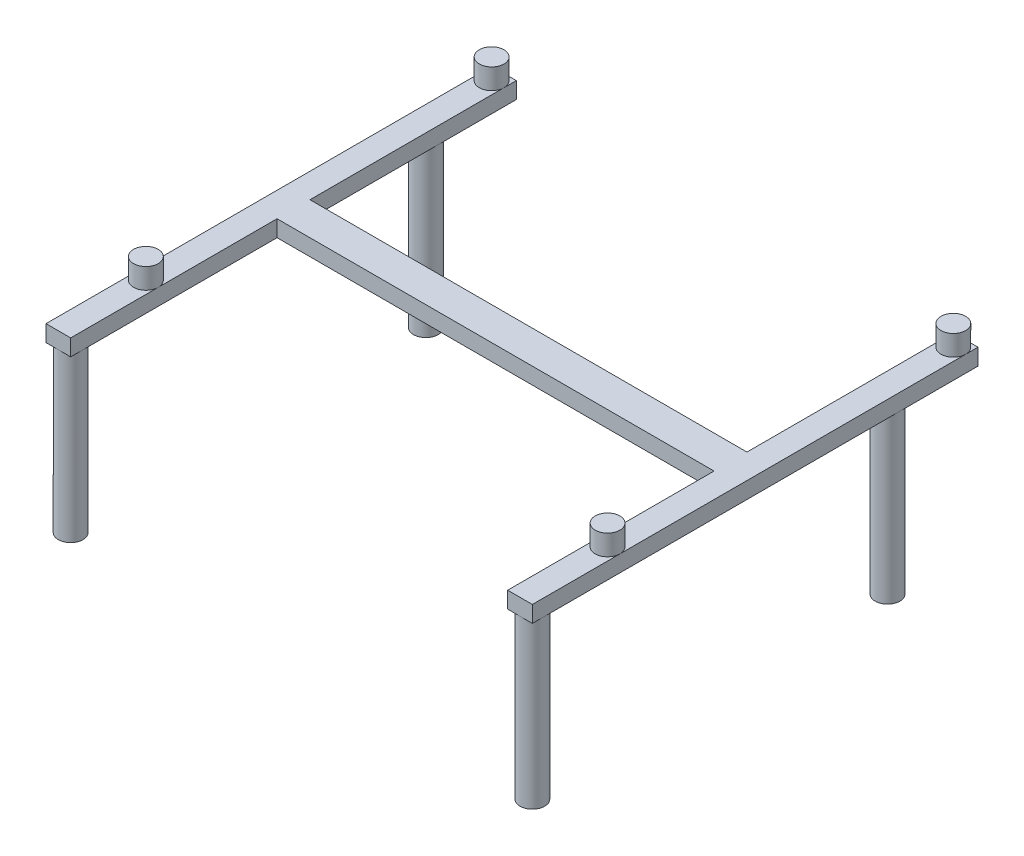
ISO-10303-21;
HEADER;
FILE_DESCRIPTION(('STEP AP214'),'2;1');
FILE_NAME('part.step','',(''),(''),'','','');
FILE_SCHEMA(('AUTOMOTIVE_DESIGN { 1 0 10303 214 1 1 1 1 }'));
ENDSEC;
DATA;
#1=APPLICATION_CONTEXT('core data for automotive mechanical design processes');
#2=APPLICATION_PROTOCOL_DEFINITION('international standard','automotive_design',2000,#1);
#3=PRODUCT_CONTEXT('',#1,'mechanical');
#4=PRODUCT('Part','Part','',(#3));
#5=PRODUCT_RELATED_PRODUCT_CATEGORY('part','',(#4));
#6=PRODUCT_DEFINITION_FORMATION('','',#4);
#7=PRODUCT_DEFINITION_CONTEXT('part definition',#1,'design');
#8=PRODUCT_DEFINITION('design','',#6,#7);
#9=PRODUCT_DEFINITION_SHAPE('','',#8);
#10=(LENGTH_UNIT() NAMED_UNIT(*) SI_UNIT(.MILLI.,.METRE.));
#11=(NAMED_UNIT(*) PLANE_ANGLE_UNIT() SI_UNIT($,.RADIAN.));
#12=(NAMED_UNIT(*) SI_UNIT($,.STERADIAN.) SOLID_ANGLE_UNIT());
#13=UNCERTAINTY_MEASURE_WITH_UNIT(LENGTH_MEASURE(1.E-05),#10,'distance_accuracy_value','');
#14=(GEOMETRIC_REPRESENTATION_CONTEXT(3) GLOBAL_UNCERTAINTY_ASSIGNED_CONTEXT((#13)) GLOBAL_UNIT_ASSIGNED_CONTEXT((#10,
#11,#12)) REPRESENTATION_CONTEXT('',''));
#15=CARTESIAN_POINT('',(0.,0.,0.));
#16=DIRECTION('',(0.,0.,1.));
#17=DIRECTION('',(1.,0.,0.));
#18=AXIS2_PLACEMENT_3D('',#15,#16,#17);
#19=CARTESIAN_POINT('',(56.13,20.,0.));
#20=DIRECTION('',(0.,-1.,0.));
#21=DIRECTION('',(0.,0.,-1.));
#22=AXIS2_PLACEMENT_3D('',#19,#20,#21);
#23=CYLINDRICAL_SURFACE('',#22,1.5);
#24=CARTESIAN_POINT('',(56.13,20.,0.));
#25=DIRECTION('',(0.,1.,0.));
#26=DIRECTION('',(0.,0.,1.));
#27=AXIS2_PLACEMENT_3D('',#24,#25,#26);
#28=CIRCLE('',#27,1.5);
#29=CARTESIAN_POINT('',(56.13,20.,1.49999999999999));
#30=VERTEX_POINT('',#29);
#31=EDGE_CURVE('E56',#30,#30,#28,.T.);
#32=ORIENTED_EDGE('',*,*,#31,.F.);
#33=EDGE_LOOP('',(#32));
#34=FACE_BOUND('',#33,.T.);
#35=CARTESIAN_POINT('',(56.13,0.,0.));
#36=DIRECTION('',(0.,1.,0.));
#37=DIRECTION('',(0.,0.,1.));
#38=AXIS2_PLACEMENT_3D('',#35,#36,#37);
#39=CIRCLE('',#38,1.5);
#40=CARTESIAN_POINT('',(56.13,0.,1.49999999999999));
#41=VERTEX_POINT('',#40);
#42=EDGE_CURVE('E11',#41,#41,#39,.T.);
#43=ORIENTED_EDGE('',*,*,#42,.T.);
#44=EDGE_LOOP('',(#43));
#45=FACE_BOUND('',#44,.T.);
#46=ADVANCED_FACE('F52',(#34,#45),#23,.T.);
#47=CARTESIAN_POINT('',(56.13,20.,0.));
#48=DIRECTION('',(0.,1.,0.));
#49=DIRECTION('',(0.,0.,1.));
#50=AXIS2_PLACEMENT_3D('',#47,#48,#49);
#51=PLANE('',#50);
#52=ORIENTED_EDGE('',*,*,#31,.T.);
#53=EDGE_LOOP('',(#52));
#54=FACE_BOUND('',#53,.T.);
#55=ADVANCED_FACE('F54',(#54),#51,.T.);
#56=CARTESIAN_POINT('',(56.13,0.,0.));
#57=DIRECTION('',(0.,1.,0.));
#58=DIRECTION('',(0.,0.,1.));
#59=AXIS2_PLACEMENT_3D('',#56,#57,#58);
#60=PLANE('',#59);
#61=ORIENTED_EDGE('',*,*,#42,.F.);
#62=EDGE_LOOP('',(#61));
#63=FACE_BOUND('',#62,.T.);
#64=ADVANCED_FACE('F71',(#63),#60,.F.);
#65=CLOSED_SHELL('',(#46,#55,#64));
#66=MANIFOLD_SOLID_BREP('B2',#65);
#67=CARTESIAN_POINT('',(56.13,20.,-43.18));
#68=DIRECTION('',(0.,-1.,0.));
#69=DIRECTION('',(0.,0.,-1.));
#70=AXIS2_PLACEMENT_3D('',#67,#68,#69);
#71=CYLINDRICAL_SURFACE('',#70,1.5);
#72=CARTESIAN_POINT('',(56.13,20.,-43.18));
#73=DIRECTION('',(0.,1.,0.));
#74=DIRECTION('',(0.,0.,1.));
#75=AXIS2_PLACEMENT_3D('',#72,#73,#74);
#76=CIRCLE('',#75,1.5);
#77=CARTESIAN_POINT('',(56.13,20.,-41.68));
#78=VERTEX_POINT('',#77);
#79=EDGE_CURVE('E106',#78,#78,#76,.T.);
#80=ORIENTED_EDGE('',*,*,#79,.F.);
#81=EDGE_LOOP('',(#80));
#82=FACE_BOUND('',#81,.T.);
#83=CARTESIAN_POINT('',(56.13,0.,-43.18));
#84=DIRECTION('',(0.,1.,0.));
#85=DIRECTION('',(0.,0.,1.));
#86=AXIS2_PLACEMENT_3D('',#83,#84,#85);
#87=CIRCLE('',#86,1.5);
#88=CARTESIAN_POINT('',(56.13,0.,-41.68));
#89=VERTEX_POINT('',#88);
#90=EDGE_CURVE('E51',#89,#89,#87,.T.);
#91=ORIENTED_EDGE('',*,*,#90,.T.);
#92=EDGE_LOOP('',(#91));
#93=FACE_BOUND('',#92,.T.);
#94=ADVANCED_FACE('F102',(#82,#93),#71,.T.);
#95=CARTESIAN_POINT('',(56.13,20.,-43.18));
#96=DIRECTION('',(0.,1.,0.));
#97=DIRECTION('',(0.,0.,1.));
#98=AXIS2_PLACEMENT_3D('',#95,#96,#97);
#99=PLANE('',#98);
#100=ORIENTED_EDGE('',*,*,#79,.T.);
#101=EDGE_LOOP('',(#100));
#102=FACE_BOUND('',#101,.T.);
#103=ADVANCED_FACE('F104',(#102),#99,.T.);
#104=CARTESIAN_POINT('',(56.13,0.,-43.18));
#105=DIRECTION('',(0.,1.,0.));
#106=DIRECTION('',(0.,0.,1.));
#107=AXIS2_PLACEMENT_3D('',#104,#105,#106);
#108=PLANE('',#107);
#109=ORIENTED_EDGE('',*,*,#90,.F.);
#110=EDGE_LOOP('',(#109));
#111=FACE_BOUND('',#110,.T.);
#112=ADVANCED_FACE('F121',(#111),#108,.F.);
#113=CLOSED_SHELL('',(#94,#103,#112));
#114=MANIFOLD_SOLID_BREP('B6',#113);
#115=CARTESIAN_POINT('',(0.,22.,0.));
#116=DIRECTION('',(0.,1.,0.));
#117=DIRECTION('',(0.,0.,1.));
#118=AXIS2_PLACEMENT_3D('',#115,#116,#117);
#119=PLANE('',#118);
#120=CARTESIAN_POINT('',(56.13,22.,-51.18));
#121=DIRECTION('',(0.,1.,0.));
#122=DIRECTION('',(0.,0.,-1.));
#123=AXIS2_PLACEMENT_3D('',#120,#121,#122);
#124=CIRCLE('',#123,1.5);
#125=CARTESIAN_POINT('',(56.13,22.,-52.68));
#126=VERTEX_POINT('',#125);
#127=CARTESIAN_POINT('',(54.63,22.,-51.18));
#128=VERTEX_POINT('',#127);
#129=EDGE_CURVE('E155',#126,#128,#124,.T.);
#130=ORIENTED_EDGE('',*,*,#129,.F.);
#131=DIRECTION('',(-1.,0.,0.));
#132=VECTOR('',#131,1.);
#133=CARTESIAN_POINT('',(57.63,22.,-52.68));
#134=LINE('',#133,#132);
#135=CARTESIAN_POINT('',(54.63,22.,-52.68));
#136=VERTEX_POINT('',#135);
#137=EDGE_CURVE('E366',#126,#136,#134,.T.);
#138=ORIENTED_EDGE('',*,*,#137,.T.);
#139=DIRECTION('',(0.,0.,1.));
#140=VECTOR('',#139,1.);
#141=CARTESIAN_POINT('',(54.63,22.,-52.68));
#142=LINE('',#141,#140);
#143=EDGE_CURVE('E372',#136,#128,#142,.T.);
#144=ORIENTED_EDGE('',*,*,#143,.T.);
#145=EDGE_LOOP('',(#130,#138,#144));
#146=FACE_BOUND('',#145,.T.);
#147=ADVANCED_FACE('F143',(#146),#119,.T.);
#148=CARTESIAN_POINT('',(57.63,22.,-51.18));
#149=VERTEX_POINT('',#148);
#150=EDGE_CURVE('E100',#128,#149,#124,.T.);
#151=ORIENTED_EDGE('',*,*,#150,.F.);
#152=CARTESIAN_POINT('',(54.63,22.,-27.59));
#153=VERTEX_POINT('',#152);
#154=EDGE_CURVE('E371',#128,#153,#142,.T.);
#155=ORIENTED_EDGE('',*,*,#154,.T.);
#156=DIRECTION('',(-1.,0.,0.));
#157=VECTOR('',#156,1.);
#158=CARTESIAN_POINT('',(1.5,22.,-27.59));
#159=LINE('',#158,#157);
#160=CARTESIAN_POINT('',(1.5,22.,-27.59));
#161=VERTEX_POINT('',#160);
#162=EDGE_CURVE('E285',#153,#161,#159,.T.);
#163=ORIENTED_EDGE('',*,*,#162,.T.);
#164=DIRECTION('',(0.,0.,-1.));
#165=VECTOR('',#164,1.);
#166=CARTESIAN_POINT('',(1.5,22.,-52.68));
#167=LINE('',#166,#165);
#168=CARTESIAN_POINT('',(1.5,22.,-51.18));
#169=VERTEX_POINT('',#168);
#170=EDGE_CURVE('E277',#161,#169,#167,.T.);
#171=ORIENTED_EDGE('',*,*,#170,.T.);
#172=CARTESIAN_POINT('',(0.,22.,-51.18));
#173=DIRECTION('',(0.,1.,0.));
#174=DIRECTION('',(0.,0.,1.));
#175=AXIS2_PLACEMENT_3D('',#172,#173,#174);
#176=CIRCLE('',#175,1.5);
#177=CARTESIAN_POINT('',(-1.50000000000001,22.,-51.18));
#178=VERTEX_POINT('',#177);
#179=EDGE_CURVE('E282',#178,#169,#176,.T.);
#180=ORIENTED_EDGE('',*,*,#179,.F.);
#181=DIRECTION('',(0.,0.,1.));
#182=VECTOR('',#181,1.);
#183=CARTESIAN_POINT('',(-1.50000000000001,22.,-52.68));
#184=LINE('',#183,#182);
#185=CARTESIAN_POINT('',(-1.5,22.,-9.14300000000001));
#186=VERTEX_POINT('',#185);
#187=EDGE_CURVE('E344',#178,#186,#184,.T.);
#188=ORIENTED_EDGE('',*,*,#187,.T.);
#189=CARTESIAN_POINT('',(0.,22.,-9.14300000000001));
#190=DIRECTION('',(0.,1.,0.));
#191=DIRECTION('',(0.,0.,1.));
#192=AXIS2_PLACEMENT_3D('',#189,#190,#191);
#193=CIRCLE('',#192,1.5);
#194=CARTESIAN_POINT('',(1.5,22.,-9.14300000000001));
#195=VERTEX_POINT('',#194);
#196=EDGE_CURVE('E310',#195,#186,#193,.T.);
#197=ORIENTED_EDGE('',*,*,#196,.F.);
#198=DIRECTION('',(0.,0.,-1.));
#199=VECTOR('',#198,1.);
#200=CARTESIAN_POINT('',(1.5,22.,-23.59));
#201=LINE('',#200,#199);
#202=CARTESIAN_POINT('',(1.5,22.,-23.59));
#203=VERTEX_POINT('',#202);
#204=EDGE_CURVE('E347',#195,#203,#201,.T.);
#205=ORIENTED_EDGE('',*,*,#204,.T.);
#206=DIRECTION('',(1.,0.,0.));
#207=VECTOR('',#206,1.);
#208=CARTESIAN_POINT('',(54.63,22.,-23.59));
#209=LINE('',#208,#207);
#210=CARTESIAN_POINT('',(54.63,22.,-23.59));
#211=VERTEX_POINT('',#210);
#212=EDGE_CURVE('E351',#203,#211,#209,.T.);
#213=ORIENTED_EDGE('',*,*,#212,.T.);
#214=DIRECTION('',(0.,0.,1.));
#215=VECTOR('',#214,1.);
#216=CARTESIAN_POINT('',(54.63,22.,-23.59));
#217=LINE('',#216,#215);
#218=CARTESIAN_POINT('',(54.63,22.,-9.14300000000001));
#219=VERTEX_POINT('',#218);
#220=EDGE_CURVE('E355',#211,#219,#217,.T.);
#221=ORIENTED_EDGE('',*,*,#220,.T.);
#222=CARTESIAN_POINT('',(56.13,22.,-9.14300000000001));
#223=DIRECTION('',(0.,1.,0.));
#224=DIRECTION('',(0.,0.,-1.));
#225=AXIS2_PLACEMENT_3D('',#222,#223,#224);
#226=CIRCLE('',#225,1.5);
#227=CARTESIAN_POINT('',(57.63,22.,-9.14300000000001));
#228=VERTEX_POINT('',#227);
#229=EDGE_CURVE('E517',#228,#219,#226,.T.);
#230=ORIENTED_EDGE('',*,*,#229,.F.);
#231=DIRECTION('',(0.,0.,-1.));
#232=VECTOR('',#231,1.);
#233=CARTESIAN_POINT('',(57.63,22.,1.49999999999999));
#234=LINE('',#233,#232);
#235=EDGE_CURVE('E367',#228,#149,#234,.T.);
#236=ORIENTED_EDGE('',*,*,#235,.T.);
#237=EDGE_LOOP('',(#151,#155,#163,#171,#180,#188,#197,#205,#213,#221,#230,#236));
#238=FACE_BOUND('',#237,.T.);
#239=ADVANCED_FACE('F279',(#238),#119,.T.);
#240=EDGE_CURVE('E514',#219,#228,#226,.T.);
#241=ORIENTED_EDGE('',*,*,#240,.F.);
#242=CARTESIAN_POINT('',(54.63,22.,1.49999999999999));
#243=VERTEX_POINT('',#242);
#244=EDGE_CURVE('E354',#219,#243,#217,.T.);
#245=ORIENTED_EDGE('',*,*,#244,.T.);
#246=DIRECTION('',(1.,0.,0.));
#247=VECTOR('',#246,1.);
#248=CARTESIAN_POINT('',(54.63,22.,1.49999999999999));
#249=LINE('',#248,#247);
#250=CARTESIAN_POINT('',(57.63,22.,1.49999999999999));
#251=VERTEX_POINT('',#250);
#252=EDGE_CURVE('E358',#243,#251,#249,.T.);
#253=ORIENTED_EDGE('',*,*,#252,.T.);
#254=EDGE_CURVE('E362',#251,#228,#234,.T.);
#255=ORIENTED_EDGE('',*,*,#254,.T.);
#256=EDGE_LOOP('',(#241,#245,#253,#255));
#257=FACE_BOUND('',#256,.T.);
#258=ADVANCED_FACE('F586',(#257),#119,.T.);
#259=EDGE_CURVE('E153',#149,#126,#124,.T.);
#260=ORIENTED_EDGE('',*,*,#259,.F.);
#261=CARTESIAN_POINT('',(57.63,22.,-52.68));
#262=VERTEX_POINT('',#261);
#263=EDGE_CURVE('E361',#149,#262,#234,.T.);
#264=ORIENTED_EDGE('',*,*,#263,.T.);
#265=EDGE_CURVE('E368',#262,#126,#134,.T.);
#266=ORIENTED_EDGE('',*,*,#265,.T.);
#267=EDGE_LOOP('',(#260,#264,#266));
#268=FACE_BOUND('',#267,.T.);
#269=ADVANCED_FACE('F616',(#268),#119,.T.);
#270=CARTESIAN_POINT('',(0.,22.,-52.68));
#271=VERTEX_POINT('',#270);
#272=EDGE_CURVE('E303',#169,#271,#176,.T.);
#273=ORIENTED_EDGE('',*,*,#272,.F.);
#274=CARTESIAN_POINT('',(1.5,22.,-52.68));
#275=VERTEX_POINT('',#274);
#276=EDGE_CURVE('E291',#169,#275,#167,.T.);
#277=ORIENTED_EDGE('',*,*,#276,.T.);
#278=DIRECTION('',(-1.,0.,0.));
#279=VECTOR('',#278,1.);
#280=CARTESIAN_POINT('',(1.5,22.,-52.68));
#281=LINE('',#280,#279);
#282=EDGE_CURVE('E305',#275,#271,#281,.T.);
#283=ORIENTED_EDGE('',*,*,#282,.T.);
#284=EDGE_LOOP('',(#273,#277,#283));
#285=FACE_BOUND('',#284,.T.);
#286=ADVANCED_FACE('F304',(#285),#119,.T.);
#287=EDGE_CURVE('E312',#271,#178,#176,.T.);
#288=ORIENTED_EDGE('',*,*,#287,.F.);
#289=CARTESIAN_POINT('',(-1.50000000000001,22.,-52.68));
#290=VERTEX_POINT('',#289);
#291=EDGE_CURVE('E338',#271,#290,#281,.T.);
#292=ORIENTED_EDGE('',*,*,#291,.T.);
#293=EDGE_CURVE('E339',#290,#178,#184,.T.);
#294=ORIENTED_EDGE('',*,*,#293,.T.);
#295=EDGE_LOOP('',(#288,#292,#294));
#296=FACE_BOUND('',#295,.T.);
#297=ADVANCED_FACE('F593',(#296),#119,.T.);
#298=CARTESIAN_POINT('',(0.,20.,0.));
#299=DIRECTION('',(0.,1.,0.));
#300=DIRECTION('',(0.,0.,1.));
#301=AXIS2_PLACEMENT_3D('',#298,#299,#300);
#302=PLANE('',#301);
#303=CARTESIAN_POINT('',(0.,20.,-43.18));
#304=DIRECTION('',(0.,1.,0.));
#305=DIRECTION('',(0.,0.,1.));
#306=AXIS2_PLACEMENT_3D('',#303,#304,#305);
#307=CIRCLE('',#306,1.5);
#308=CARTESIAN_POINT('',(1.5,20.,-43.18));
#309=VERTEX_POINT('',#308);
#310=CARTESIAN_POINT('',(-1.5,20.,-43.18));
#311=VERTEX_POINT('',#310);
#312=EDGE_CURVE('E330',#309,#311,#307,.T.);
#313=ORIENTED_EDGE('',*,*,#312,.T.);
#314=DIRECTION('',(0.,0.,1.));
#315=VECTOR('',#314,1.);
#316=CARTESIAN_POINT('',(-1.50000000000001,20.,-52.68));
#317=LINE('',#316,#315);
#318=CARTESIAN_POINT('',(-1.50000000000001,20.,-52.68));
#319=VERTEX_POINT('',#318);
#320=EDGE_CURVE('E382',#319,#311,#317,.T.);
#321=ORIENTED_EDGE('',*,*,#320,.F.);
#322=DIRECTION('',(-1.,0.,0.));
#323=VECTOR('',#322,1.);
#324=CARTESIAN_POINT('',(1.5,20.,-52.68));
#325=LINE('',#324,#323);
#326=CARTESIAN_POINT('',(1.5,20.,-52.68));
#327=VERTEX_POINT('',#326);
#328=EDGE_CURVE('E329',#327,#319,#325,.T.);
#329=ORIENTED_EDGE('',*,*,#328,.F.);
#330=DIRECTION('',(0.,0.,-1.));
#331=VECTOR('',#330,1.);
#332=CARTESIAN_POINT('',(1.5,20.,-52.68));
#333=LINE('',#332,#331);
#334=EDGE_CURVE('E417',#309,#327,#333,.T.);
#335=ORIENTED_EDGE('',*,*,#334,.F.);
#336=EDGE_LOOP('',(#313,#321,#329,#335));
#337=FACE_BOUND('',#336,.T.);
#338=ADVANCED_FACE('F608',(#337),#302,.F.);
#339=CARTESIAN_POINT('',(0.,20.,0.));
#340=DIRECTION('',(0.,-1.,0.));
#341=DIRECTION('',(0.,0.,-1.));
#342=AXIS2_PLACEMENT_3D('',#339,#340,#341);
#343=CYLINDRICAL_SURFACE('',#342,1.5);
#344=CARTESIAN_POINT('',(0.,20.,0.));
#345=DIRECTION('',(0.,1.,0.));
#346=DIRECTION('',(0.,0.,1.));
#347=AXIS2_PLACEMENT_3D('',#344,#345,#346);
#348=CIRCLE('',#347,1.5);
#349=CARTESIAN_POINT('',(0.,20.,1.5));
#350=VERTEX_POINT('',#349);
#351=CARTESIAN_POINT('',(1.5,20.,0.));
#352=VERTEX_POINT('',#351);
#353=EDGE_CURVE('E315',#350,#352,#348,.T.);
#354=ORIENTED_EDGE('',*,*,#353,.F.);
#355=CARTESIAN_POINT('',(-1.5,20.,0.));
#356=VERTEX_POINT('',#355);
#357=EDGE_CURVE('E321',#356,#350,#348,.T.);
#358=ORIENTED_EDGE('',*,*,#357,.F.);
#359=EDGE_CURVE('E320',#352,#356,#348,.T.);
#360=ORIENTED_EDGE('',*,*,#359,.F.);
#361=EDGE_LOOP('',(#354,#358,#360));
#362=FACE_BOUND('',#361,.T.);
#363=CARTESIAN_POINT('',(0.,0.,0.));
#364=DIRECTION('',(0.,1.,0.));
#365=DIRECTION('',(0.,0.,1.));
#366=AXIS2_PLACEMENT_3D('',#363,#364,#365);
#367=CIRCLE('',#366,1.5);
#368=CARTESIAN_POINT('',(0.,0.,1.5));
#369=VERTEX_POINT('',#368);
#370=EDGE_CURVE('E147',#369,#369,#367,.T.);
#371=ORIENTED_EDGE('',*,*,#370,.T.);
#372=EDGE_LOOP('',(#371));
#373=FACE_BOUND('',#372,.T.);
#374=ADVANCED_FACE('F145',(#362,#373),#343,.T.);
#375=CARTESIAN_POINT('',(0.,0.,0.));
#376=DIRECTION('',(0.,1.,0.));
#377=DIRECTION('',(0.,0.,1.));
#378=AXIS2_PLACEMENT_3D('',#375,#376,#377);
#379=PLANE('',#378);
#380=ORIENTED_EDGE('',*,*,#370,.F.);
#381=EDGE_LOOP('',(#380));
#382=FACE_BOUND('',#381,.T.);
#383=ADVANCED_FACE('F853',(#382),#379,.F.);
#384=DIRECTION('',(1.,0.,0.));
#385=VECTOR('',#384,1.);
#386=CARTESIAN_POINT('',(-1.5,20.,1.5));
#387=LINE('',#386,#385);
#388=CARTESIAN_POINT('',(1.5,20.,1.5));
#389=VERTEX_POINT('',#388);
#390=EDGE_CURVE('E385',#350,#389,#387,.T.);
#391=ORIENTED_EDGE('',*,*,#390,.F.);
#392=ORIENTED_EDGE('',*,*,#353,.T.);
#393=DIRECTION('',(0.,0.,-1.));
#394=VECTOR('',#393,1.);
#395=CARTESIAN_POINT('',(1.5,20.,-23.59));
#396=LINE('',#395,#394);
#397=EDGE_CURVE('E392',#389,#352,#396,.T.);
#398=ORIENTED_EDGE('',*,*,#397,.F.);
#399=EDGE_LOOP('',(#391,#392,#398));
#400=FACE_BOUND('',#399,.T.);
#401=ADVANCED_FACE('F494',(#400),#302,.F.);
#402=EDGE_CURVE('E334',#311,#309,#307,.T.);
#403=ORIENTED_EDGE('',*,*,#402,.T.);
#404=CARTESIAN_POINT('',(1.5,20.,-27.59));
#405=VERTEX_POINT('',#404);
#406=EDGE_CURVE('E418',#405,#309,#333,.T.);
#407=ORIENTED_EDGE('',*,*,#406,.F.);
#408=DIRECTION('',(-1.,0.,0.));
#409=VECTOR('',#408,1.);
#410=CARTESIAN_POINT('',(1.5,20.,-27.59));
#411=LINE('',#410,#409);
#412=CARTESIAN_POINT('',(54.63,20.,-27.59));
#413=VERTEX_POINT('',#412);
#414=EDGE_CURVE('E414',#413,#405,#411,.T.);
#415=ORIENTED_EDGE('',*,*,#414,.F.);
#416=DIRECTION('',(0.,0.,1.));
#417=VECTOR('',#416,1.);
#418=CARTESIAN_POINT('',(54.63,20.,-52.68));
#419=LINE('',#418,#417);
#420=CARTESIAN_POINT('',(54.63,20.,-52.68));
#421=VERTEX_POINT('',#420);
#422=EDGE_CURVE('E411',#421,#413,#419,.T.);
#423=ORIENTED_EDGE('',*,*,#422,.F.);
#424=DIRECTION('',(-1.,0.,0.));
#425=VECTOR('',#424,1.);
#426=CARTESIAN_POINT('',(57.63,20.,-52.68));
#427=LINE('',#426,#425);
#428=CARTESIAN_POINT('',(57.63,20.,-52.68));
#429=VERTEX_POINT('',#428);
#430=EDGE_CURVE('E408',#429,#421,#427,.T.);
#431=ORIENTED_EDGE('',*,*,#430,.F.);
#432=DIRECTION('',(0.,0.,-1.));
#433=VECTOR('',#432,1.);
#434=CARTESIAN_POINT('',(57.63,20.,1.49999999999999));
#435=LINE('',#434,#433);
#436=CARTESIAN_POINT('',(57.63,20.,1.49999999999999));
#437=VERTEX_POINT('',#436);
#438=EDGE_CURVE('E405',#437,#429,#435,.T.);
#439=ORIENTED_EDGE('',*,*,#438,.F.);
#440=DIRECTION('',(1.,0.,0.));
#441=VECTOR('',#440,1.);
#442=CARTESIAN_POINT('',(54.63,20.,1.49999999999999));
#443=LINE('',#442,#441);
#444=CARTESIAN_POINT('',(54.63,20.,1.49999999999999));
#445=VERTEX_POINT('',#444);
#446=EDGE_CURVE('E402',#445,#437,#443,.T.);
#447=ORIENTED_EDGE('',*,*,#446,.F.);
#448=DIRECTION('',(0.,0.,1.));
#449=VECTOR('',#448,1.);
#450=CARTESIAN_POINT('',(54.63,20.,-23.59));
#451=LINE('',#450,#449);
#452=CARTESIAN_POINT('',(54.63,20.,-23.59));
#453=VERTEX_POINT('',#452);
#454=EDGE_CURVE('E399',#453,#445,#451,.T.);
#455=ORIENTED_EDGE('',*,*,#454,.F.);
#456=DIRECTION('',(1.,0.,0.));
#457=VECTOR('',#456,1.);
#458=CARTESIAN_POINT('',(54.63,20.,-23.59));
#459=LINE('',#458,#457);
#460=CARTESIAN_POINT('',(1.5,20.,-23.59));
#461=VERTEX_POINT('',#460);
#462=EDGE_CURVE('E396',#461,#453,#459,.T.);
#463=ORIENTED_EDGE('',*,*,#462,.F.);
#464=EDGE_CURVE('E391',#352,#461,#396,.T.);
#465=ORIENTED_EDGE('',*,*,#464,.F.);
#466=ORIENTED_EDGE('',*,*,#359,.T.);
#467=EDGE_CURVE('E386',#311,#356,#317,.T.);
#468=ORIENTED_EDGE('',*,*,#467,.F.);
#469=EDGE_LOOP('',(#403,#407,#415,#423,#431,#439,#447,#455,#463,#465,#466,#468));
#470=FACE_BOUND('',#469,.T.);
#471=ADVANCED_FACE('F484',(#470),#302,.F.);
#472=CARTESIAN_POINT('',(-1.5,20.,1.5));
#473=VERTEX_POINT('',#472);
#474=EDGE_CURVE('E381',#356,#473,#317,.T.);
#475=ORIENTED_EDGE('',*,*,#474,.F.);
#476=ORIENTED_EDGE('',*,*,#357,.T.);
#477=EDGE_CURVE('E387',#473,#350,#387,.T.);
#478=ORIENTED_EDGE('',*,*,#477,.F.);
#479=EDGE_LOOP('',(#475,#476,#478));
#480=FACE_BOUND('',#479,.T.);
#481=ADVANCED_FACE('F487',(#480),#302,.F.);
#482=CARTESIAN_POINT('',(1.5,22.,-52.68));
#483=DIRECTION('',(0.,0.,1.));
#484=DIRECTION('',(1.,0.,0.));
#485=AXIS2_PLACEMENT_3D('',#482,#483,#484);
#486=PLANE('',#485);
#487=ORIENTED_EDGE('',*,*,#328,.T.);
#488=DIRECTION('',(0.,-1.,0.));
#489=VECTOR('',#488,1.);
#490=CARTESIAN_POINT('',(-1.50000000000001,22.,-52.68));
#491=LINE('',#490,#489);
#492=EDGE_CURVE('E462',#290,#319,#491,.T.);
#493=ORIENTED_EDGE('',*,*,#492,.F.);
#494=ORIENTED_EDGE('',*,*,#291,.F.);
#495=ORIENTED_EDGE('',*,*,#282,.F.);
#496=DIRECTION('',(0.,-1.,0.));
#497=VECTOR('',#496,1.);
#498=CARTESIAN_POINT('',(1.5,22.,-52.68));
#499=LINE('',#498,#497);
#500=EDGE_CURVE('E290',#275,#327,#499,.T.);
#501=ORIENTED_EDGE('',*,*,#500,.T.);
#502=EDGE_LOOP('',(#487,#493,#494,#495,#501));
#503=FACE_BOUND('',#502,.T.);
#504=ADVANCED_FACE('F619',(#503),#486,.F.);
#505=CARTESIAN_POINT('',(-1.50000000000001,22.,-52.68));
#506=DIRECTION('',(1.,0.,0.));
#507=DIRECTION('',(0.,0.,-1.));
#508=AXIS2_PLACEMENT_3D('',#505,#506,#507);
#509=PLANE('',#508);
#510=ORIENTED_EDGE('',*,*,#320,.T.);
#511=ORIENTED_EDGE('',*,*,#467,.T.);
#512=ORIENTED_EDGE('',*,*,#474,.T.);
#513=DIRECTION('',(0.,-1.,0.));
#514=VECTOR('',#513,1.);
#515=CARTESIAN_POINT('',(-1.5,22.,1.5));
#516=LINE('',#515,#514);
#517=CARTESIAN_POINT('',(-1.5,22.,1.5));
#518=VERTEX_POINT('',#517);
#519=EDGE_CURVE('E458',#518,#473,#516,.T.);
#520=ORIENTED_EDGE('',*,*,#519,.F.);
#521=EDGE_CURVE('E337',#186,#518,#184,.T.);
#522=ORIENTED_EDGE('',*,*,#521,.F.);
#523=ORIENTED_EDGE('',*,*,#187,.F.);
#524=ORIENTED_EDGE('',*,*,#293,.F.);
#525=ORIENTED_EDGE('',*,*,#492,.T.);
#526=EDGE_LOOP('',(#510,#511,#512,#520,#522,#523,#524,#525));
#527=FACE_BOUND('',#526,.T.);
#528=ADVANCED_FACE('F491',(#527),#509,.F.);
#529=CARTESIAN_POINT('',(-1.5,22.,1.5));
#530=DIRECTION('',(0.,0.,-1.));
#531=DIRECTION('',(-1.,0.,0.));
#532=AXIS2_PLACEMENT_3D('',#529,#530,#531);
#533=PLANE('',#532);
#534=ORIENTED_EDGE('',*,*,#477,.T.);
#535=ORIENTED_EDGE('',*,*,#390,.T.);
#536=DIRECTION('',(0.,-1.,0.));
#537=VECTOR('',#536,1.);
#538=CARTESIAN_POINT('',(1.5,22.,1.5));
#539=LINE('',#538,#537);
#540=CARTESIAN_POINT('',(1.5,22.,1.5));
#541=VERTEX_POINT('',#540);
#542=EDGE_CURVE('E454',#541,#389,#539,.T.);
#543=ORIENTED_EDGE('',*,*,#542,.F.);
#544=DIRECTION('',(1.,0.,0.));
#545=VECTOR('',#544,1.);
#546=CARTESIAN_POINT('',(-1.5,22.,1.5));
#547=LINE('',#546,#545);
#548=EDGE_CURVE('E343',#518,#541,#547,.T.);
#549=ORIENTED_EDGE('',*,*,#548,.F.);
#550=ORIENTED_EDGE('',*,*,#519,.T.);
#551=EDGE_LOOP('',(#534,#535,#543,#549,#550));
#552=FACE_BOUND('',#551,.T.);
#553=ADVANCED_FACE('F498',(#552),#533,.F.);
#554=CARTESIAN_POINT('',(1.5,22.,-23.59));
#555=DIRECTION('',(-1.,0.,0.));
#556=DIRECTION('',(0.,0.,1.));
#557=AXIS2_PLACEMENT_3D('',#554,#555,#556);
#558=PLANE('',#557);
#559=ORIENTED_EDGE('',*,*,#397,.T.);
#560=ORIENTED_EDGE('',*,*,#464,.T.);
#561=DIRECTION('',(0.,-1.,0.));
#562=VECTOR('',#561,1.);
#563=CARTESIAN_POINT('',(1.5,22.,-23.59));
#564=LINE('',#563,#562);
#565=EDGE_CURVE('E450',#203,#461,#564,.T.);
#566=ORIENTED_EDGE('',*,*,#565,.F.);
#567=ORIENTED_EDGE('',*,*,#204,.F.);
#568=EDGE_CURVE('E348',#541,#195,#201,.T.);
#569=ORIENTED_EDGE('',*,*,#568,.F.);
#570=ORIENTED_EDGE('',*,*,#542,.T.);
#571=EDGE_LOOP('',(#559,#560,#566,#567,#569,#570));
#572=FACE_BOUND('',#571,.T.);
#573=ADVANCED_FACE('F566',(#572),#558,.F.);
#574=CARTESIAN_POINT('',(54.63,22.,-23.59));
#575=DIRECTION('',(0.,0.,-1.));
#576=DIRECTION('',(-1.,0.,0.));
#577=AXIS2_PLACEMENT_3D('',#574,#575,#576);
#578=PLANE('',#577);
#579=ORIENTED_EDGE('',*,*,#462,.T.);
#580=DIRECTION('',(0.,-1.,0.));
#581=VECTOR('',#580,1.);
#582=CARTESIAN_POINT('',(54.63,22.,-23.59));
#583=LINE('',#582,#581);
#584=EDGE_CURVE('E446',#211,#453,#583,.T.);
#585=ORIENTED_EDGE('',*,*,#584,.F.);
#586=ORIENTED_EDGE('',*,*,#212,.F.);
#587=ORIENTED_EDGE('',*,*,#565,.T.);
#588=EDGE_LOOP('',(#579,#585,#586,#587));
#589=FACE_BOUND('',#588,.T.);
#590=ADVANCED_FACE('F570',(#589),#578,.F.);
#591=CARTESIAN_POINT('',(54.63,22.,-23.59));
#592=DIRECTION('',(1.,0.,0.));
#593=DIRECTION('',(0.,0.,-1.));
#594=AXIS2_PLACEMENT_3D('',#591,#592,#593);
#595=PLANE('',#594);
#596=ORIENTED_EDGE('',*,*,#454,.T.);
#597=DIRECTION('',(0.,-1.,0.));
#598=VECTOR('',#597,1.);
#599=CARTESIAN_POINT('',(54.63,22.,1.49999999999999));
#600=LINE('',#599,#598);
#601=EDGE_CURVE('E442',#243,#445,#600,.T.);
#602=ORIENTED_EDGE('',*,*,#601,.F.);
#603=ORIENTED_EDGE('',*,*,#244,.F.);
#604=ORIENTED_EDGE('',*,*,#220,.F.);
#605=ORIENTED_EDGE('',*,*,#584,.T.);
#606=EDGE_LOOP('',(#596,#602,#603,#604,#605));
#607=FACE_BOUND('',#606,.T.);
#608=ADVANCED_FACE('F577',(#607),#595,.F.);
#609=CARTESIAN_POINT('',(54.63,22.,1.49999999999999));
#610=DIRECTION('',(0.,0.,-1.));
#611=DIRECTION('',(-1.,0.,0.));
#612=AXIS2_PLACEMENT_3D('',#609,#610,#611);
#613=PLANE('',#612);
#614=ORIENTED_EDGE('',*,*,#446,.T.);
#615=DIRECTION('',(0.,-1.,0.));
#616=VECTOR('',#615,1.);
#617=CARTESIAN_POINT('',(57.63,22.,1.49999999999999));
#618=LINE('',#617,#616);
#619=EDGE_CURVE('E438',#251,#437,#618,.T.);
#620=ORIENTED_EDGE('',*,*,#619,.F.);
#621=ORIENTED_EDGE('',*,*,#252,.F.);
#622=ORIENTED_EDGE('',*,*,#601,.T.);
#623=EDGE_LOOP('',(#614,#620,#621,#622));
#624=FACE_BOUND('',#623,.T.);
#625=ADVANCED_FACE('F582',(#624),#613,.F.);
#626=CARTESIAN_POINT('',(57.63,22.,1.49999999999999));
#627=DIRECTION('',(-1.,0.,0.));
#628=DIRECTION('',(0.,0.,1.));
#629=AXIS2_PLACEMENT_3D('',#626,#627,#628);
#630=PLANE('',#629);
#631=ORIENTED_EDGE('',*,*,#438,.T.);
#632=DIRECTION('',(0.,-1.,0.));
#633=VECTOR('',#632,1.);
#634=CARTESIAN_POINT('',(57.63,22.,-52.68));
#635=LINE('',#634,#633);
#636=EDGE_CURVE('E434',#262,#429,#635,.T.);
#637=ORIENTED_EDGE('',*,*,#636,.F.);
#638=ORIENTED_EDGE('',*,*,#263,.F.);
#639=ORIENTED_EDGE('',*,*,#235,.F.);
#640=ORIENTED_EDGE('',*,*,#254,.F.);
#641=ORIENTED_EDGE('',*,*,#619,.T.);
#642=EDGE_LOOP('',(#631,#637,#638,#639,#640,#641));
#643=FACE_BOUND('',#642,.T.);
#644=ADVANCED_FACE('F773',(#643),#630,.F.);
#645=CARTESIAN_POINT('',(57.63,22.,-52.68));
#646=DIRECTION('',(0.,0.,1.));
#647=DIRECTION('',(1.,0.,0.));
#648=AXIS2_PLACEMENT_3D('',#645,#646,#647);
#649=PLANE('',#648);
#650=ORIENTED_EDGE('',*,*,#430,.T.);
#651=DIRECTION('',(0.,-1.,0.));
#652=VECTOR('',#651,1.);
#653=CARTESIAN_POINT('',(54.63,22.,-52.68));
#654=LINE('',#653,#652);
#655=EDGE_CURVE('E430',#136,#421,#654,.T.);
#656=ORIENTED_EDGE('',*,*,#655,.F.);
#657=ORIENTED_EDGE('',*,*,#137,.F.);
#658=ORIENTED_EDGE('',*,*,#265,.F.);
#659=ORIENTED_EDGE('',*,*,#636,.T.);
#660=EDGE_LOOP('',(#650,#656,#657,#658,#659));
#661=FACE_BOUND('',#660,.T.);
#662=ADVANCED_FACE('F765',(#661),#649,.F.);
#663=CARTESIAN_POINT('',(54.63,22.,-52.68));
#664=DIRECTION('',(1.,0.,0.));
#665=DIRECTION('',(0.,0.,-1.));
#666=AXIS2_PLACEMENT_3D('',#663,#664,#665);
#667=PLANE('',#666);
#668=ORIENTED_EDGE('',*,*,#422,.T.);
#669=DIRECTION('',(0.,-1.,0.));
#670=VECTOR('',#669,1.);
#671=CARTESIAN_POINT('',(54.63,22.,-27.59));
#672=LINE('',#671,#670);
#673=EDGE_CURVE('E426',#153,#413,#672,.T.);
#674=ORIENTED_EDGE('',*,*,#673,.F.);
#675=ORIENTED_EDGE('',*,*,#154,.F.);
#676=ORIENTED_EDGE('',*,*,#143,.F.);
#677=ORIENTED_EDGE('',*,*,#655,.T.);
#678=EDGE_LOOP('',(#668,#674,#675,#676,#677));
#679=FACE_BOUND('',#678,.T.);
#680=ADVANCED_FACE('F552',(#679),#667,.F.);
#681=CARTESIAN_POINT('',(1.5,22.,-27.59));
#682=DIRECTION('',(0.,0.,1.));
#683=DIRECTION('',(1.,0.,0.));
#684=AXIS2_PLACEMENT_3D('',#681,#682,#683);
#685=PLANE('',#684);
#686=ORIENTED_EDGE('',*,*,#414,.T.);
#687=DIRECTION('',(0.,-1.,0.));
#688=VECTOR('',#687,1.);
#689=CARTESIAN_POINT('',(1.5,22.,-27.59));
#690=LINE('',#689,#688);
#691=EDGE_CURVE('E423',#161,#405,#690,.T.);
#692=ORIENTED_EDGE('',*,*,#691,.F.);
#693=ORIENTED_EDGE('',*,*,#162,.F.);
#694=ORIENTED_EDGE('',*,*,#673,.T.);
#695=EDGE_LOOP('',(#686,#692,#693,#694));
#696=FACE_BOUND('',#695,.T.);
#697=ADVANCED_FACE('F602',(#696),#685,.F.);
#698=CARTESIAN_POINT('',(1.5,22.,-52.68));
#699=DIRECTION('',(-1.,0.,0.));
#700=DIRECTION('',(0.,0.,1.));
#701=AXIS2_PLACEMENT_3D('',#698,#699,#700);
#702=PLANE('',#701);
#703=ORIENTED_EDGE('',*,*,#406,.T.);
#704=ORIENTED_EDGE('',*,*,#334,.T.);
#705=ORIENTED_EDGE('',*,*,#500,.F.);
#706=ORIENTED_EDGE('',*,*,#276,.F.);
#707=ORIENTED_EDGE('',*,*,#170,.F.);
#708=ORIENTED_EDGE('',*,*,#691,.T.);
#709=EDGE_LOOP('',(#703,#704,#705,#706,#707,#708));
#710=FACE_BOUND('',#709,.T.);
#711=ADVANCED_FACE('F296',(#710),#702,.F.);
#712=EDGE_CURVE('E318',#186,#195,#193,.T.);
#713=ORIENTED_EDGE('',*,*,#712,.F.);
#714=ORIENTED_EDGE('',*,*,#521,.T.);
#715=ORIENTED_EDGE('',*,*,#548,.T.);
#716=ORIENTED_EDGE('',*,*,#568,.T.);
#717=EDGE_LOOP('',(#713,#714,#715,#716));
#718=FACE_BOUND('',#717,.T.);
#719=ADVANCED_FACE('F589',(#718),#119,.T.);
#720=CARTESIAN_POINT('',(0.,20.,-43.18));
#721=DIRECTION('',(0.,-1.,0.));
#722=DIRECTION('',(0.,0.,-1.));
#723=AXIS2_PLACEMENT_3D('',#720,#721,#722);
#724=CYLINDRICAL_SURFACE('',#723,1.5);
#725=ORIENTED_EDGE('',*,*,#312,.F.);
#726=ORIENTED_EDGE('',*,*,#402,.F.);
#727=EDGE_LOOP('',(#725,#726));
#728=FACE_BOUND('',#727,.T.);
#729=CARTESIAN_POINT('',(0.,0.,-43.18));
#730=DIRECTION('',(0.,1.,0.));
#731=DIRECTION('',(0.,0.,1.));
#732=AXIS2_PLACEMENT_3D('',#729,#730,#731);
#733=CIRCLE('',#732,1.5);
#734=CARTESIAN_POINT('',(0.,0.,-41.68));
#735=VERTEX_POINT('',#734);
#736=EDGE_CURVE('E325',#735,#735,#733,.T.);
#737=ORIENTED_EDGE('',*,*,#736,.T.);
#738=EDGE_LOOP('',(#737));
#739=FACE_BOUND('',#738,.T.);
#740=ADVANCED_FACE('F591',(#728,#739),#724,.T.);
#741=CARTESIAN_POINT('',(0.,0.,-43.18));
#742=DIRECTION('',(0.,1.,0.));
#743=DIRECTION('',(0.,0.,1.));
#744=AXIS2_PLACEMENT_3D('',#741,#742,#743);
#745=PLANE('',#744);
#746=ORIENTED_EDGE('',*,*,#736,.F.);
#747=EDGE_LOOP('',(#746));
#748=FACE_BOUND('',#747,.T.);
#749=ADVANCED_FACE('F599',(#748),#745,.F.);
#750=CARTESIAN_POINT('',(0.,24.5,-51.18));
#751=DIRECTION('',(0.,-1.,0.));
#752=DIRECTION('',(0.,0.,-1.));
#753=AXIS2_PLACEMENT_3D('',#750,#751,#752);
#754=CYLINDRICAL_SURFACE('',#753,1.5);
#755=CARTESIAN_POINT('',(0.,24.5,-51.18));
#756=DIRECTION('',(0.,1.,0.));
#757=DIRECTION('',(0.,0.,1.));
#758=AXIS2_PLACEMENT_3D('',#755,#756,#757);
#759=CIRCLE('',#758,1.5);
#760=CARTESIAN_POINT('',(0.,24.5,-49.68));
#761=VERTEX_POINT('',#760);
#762=EDGE_CURVE('E309',#761,#761,#759,.T.);
#763=ORIENTED_EDGE('',*,*,#762,.F.);
#764=EDGE_LOOP('',(#763));
#765=FACE_BOUND('',#764,.T.);
#766=ORIENTED_EDGE('',*,*,#272,.T.);
#767=ORIENTED_EDGE('',*,*,#287,.T.);
#768=ORIENTED_EDGE('',*,*,#179,.T.);
#769=EDGE_LOOP('',(#766,#767,#768));
#770=FACE_BOUND('',#769,.T.);
#771=ADVANCED_FACE('F313',(#765,#770),#754,.T.);
#772=CARTESIAN_POINT('',(0.,24.5,-51.18));
#773=DIRECTION('',(0.,1.,0.));
#774=DIRECTION('',(0.,0.,1.));
#775=AXIS2_PLACEMENT_3D('',#772,#773,#774);
#776=PLANE('',#775);
#777=ORIENTED_EDGE('',*,*,#762,.T.);
#778=EDGE_LOOP('',(#777));
#779=FACE_BOUND('',#778,.T.);
#780=ADVANCED_FACE('F631',(#779),#776,.T.);
#781=CARTESIAN_POINT('',(0.,24.5,-9.14300000000001));
#782=DIRECTION('',(0.,-1.,0.));
#783=DIRECTION('',(0.,0.,-1.));
#784=AXIS2_PLACEMENT_3D('',#781,#782,#783);
#785=CYLINDRICAL_SURFACE('',#784,1.5);
#786=CARTESIAN_POINT('',(0.,24.5,-9.14300000000001));
#787=DIRECTION('',(0.,1.,0.));
#788=DIRECTION('',(0.,0.,1.));
#789=AXIS2_PLACEMENT_3D('',#786,#787,#788);
#790=CIRCLE('',#789,1.5);
#791=CARTESIAN_POINT('',(0.,24.5,-7.64300000000001));
#792=VERTEX_POINT('',#791);
#793=EDGE_CURVE('E510',#792,#792,#790,.T.);
#794=ORIENTED_EDGE('',*,*,#793,.F.);
#795=EDGE_LOOP('',(#794));
#796=FACE_BOUND('',#795,.T.);
#797=ORIENTED_EDGE('',*,*,#196,.T.);
#798=ORIENTED_EDGE('',*,*,#712,.T.);
#799=EDGE_LOOP('',(#797,#798));
#800=FACE_BOUND('',#799,.T.);
#801=ADVANCED_FACE('F508',(#796,#800),#785,.T.);
#802=CARTESIAN_POINT('',(0.,24.5,-9.14300000000001));
#803=DIRECTION('',(0.,1.,0.));
#804=DIRECTION('',(0.,0.,1.));
#805=AXIS2_PLACEMENT_3D('',#802,#803,#804);
#806=PLANE('',#805);
#807=ORIENTED_EDGE('',*,*,#793,.T.);
#808=EDGE_LOOP('',(#807));
#809=FACE_BOUND('',#808,.T.);
#810=ADVANCED_FACE('F648',(#809),#806,.T.);
#811=CARTESIAN_POINT('',(56.13,24.5,-9.14300000000001));
#812=DIRECTION('',(0.,-1.,0.));
#813=DIRECTION('',(0.,0.,-1.));
#814=AXIS2_PLACEMENT_3D('',#811,#812,#813);
#815=CYLINDRICAL_SURFACE('',#814,1.5);
#816=CARTESIAN_POINT('',(56.13,24.5,-9.14300000000001));
#817=DIRECTION('',(0.,1.,0.));
#818=DIRECTION('',(0.,0.,-1.));
#819=AXIS2_PLACEMENT_3D('',#816,#817,#818);
#820=CIRCLE('',#819,1.5);
#821=CARTESIAN_POINT('',(56.13,24.5,-10.643));
#822=VERTEX_POINT('',#821);
#823=EDGE_CURVE('E526',#822,#822,#820,.T.);
#824=ORIENTED_EDGE('',*,*,#823,.F.);
#825=EDGE_LOOP('',(#824));
#826=FACE_BOUND('',#825,.T.);
#827=ORIENTED_EDGE('',*,*,#240,.T.);
#828=ORIENTED_EDGE('',*,*,#229,.T.);
#829=EDGE_LOOP('',(#827,#828));
#830=FACE_BOUND('',#829,.T.);
#831=ADVANCED_FACE('F645',(#826,#830),#815,.T.);
#832=CARTESIAN_POINT('',(56.13,24.5,-9.14300000000001));
#833=DIRECTION('',(0.,-1.,0.));
#834=DIRECTION('',(0.,0.,-1.));
#835=AXIS2_PLACEMENT_3D('',#832,#833,#834);
#836=PLANE('',#835);
#837=ORIENTED_EDGE('',*,*,#823,.T.);
#838=EDGE_LOOP('',(#837));
#839=FACE_BOUND('',#838,.T.);
#840=ADVANCED_FACE('F544',(#839),#836,.F.);
#841=CARTESIAN_POINT('',(56.13,24.5,-51.18));
#842=DIRECTION('',(0.,-1.,0.));
#843=DIRECTION('',(0.,0.,-1.));
#844=AXIS2_PLACEMENT_3D('',#841,#842,#843);
#845=CYLINDRICAL_SURFACE('',#844,1.5);
#846=CARTESIAN_POINT('',(56.13,24.5,-51.18));
#847=DIRECTION('',(0.,1.,0.));
#848=DIRECTION('',(0.,0.,-1.));
#849=AXIS2_PLACEMENT_3D('',#846,#847,#848);
#850=CIRCLE('',#849,1.5);
#851=CARTESIAN_POINT('',(56.13,24.5,-52.68));
#852=VERTEX_POINT('',#851);
#853=EDGE_CURVE('E534',#852,#852,#850,.T.);
#854=ORIENTED_EDGE('',*,*,#853,.F.);
#855=EDGE_LOOP('',(#854));
#856=FACE_BOUND('',#855,.T.);
#857=ORIENTED_EDGE('',*,*,#129,.T.);
#858=ORIENTED_EDGE('',*,*,#150,.T.);
#859=ORIENTED_EDGE('',*,*,#259,.T.);
#860=EDGE_LOOP('',(#857,#858,#859));
#861=FACE_BOUND('',#860,.T.);
#862=ADVANCED_FACE('F541',(#856,#861),#845,.T.);
#863=CARTESIAN_POINT('',(56.13,24.5,-51.18));
#864=DIRECTION('',(0.,-1.,0.));
#865=DIRECTION('',(0.,0.,-1.));
#866=AXIS2_PLACEMENT_3D('',#863,#864,#865);
#867=PLANE('',#866);
#868=ORIENTED_EDGE('',*,*,#853,.T.);
#869=EDGE_LOOP('',(#868));
#870=FACE_BOUND('',#869,.T.);
#871=ADVANCED_FACE('F539',(#870),#867,.F.);
#872=CLOSED_SHELL('',(#147,#239,#258,#269,#286,#297,#338,#374,#383,#401,#471,#481,#504,#528,
#553,#573,#590,#608,#625,#644,#662,#680,#697,#711,#719,#740,#749,#771,#780,#801,#810,#831,#840,
#862,#871));
#873=MANIFOLD_SOLID_BREP('B46',#872);
#874=ADVANCED_BREP_SHAPE_REPRESENTATION('',(#18,#66,#114,#873),#14);
#875=SHAPE_DEFINITION_REPRESENTATION(#9,#874);
ENDSEC;
END-ISO-10303-21;
